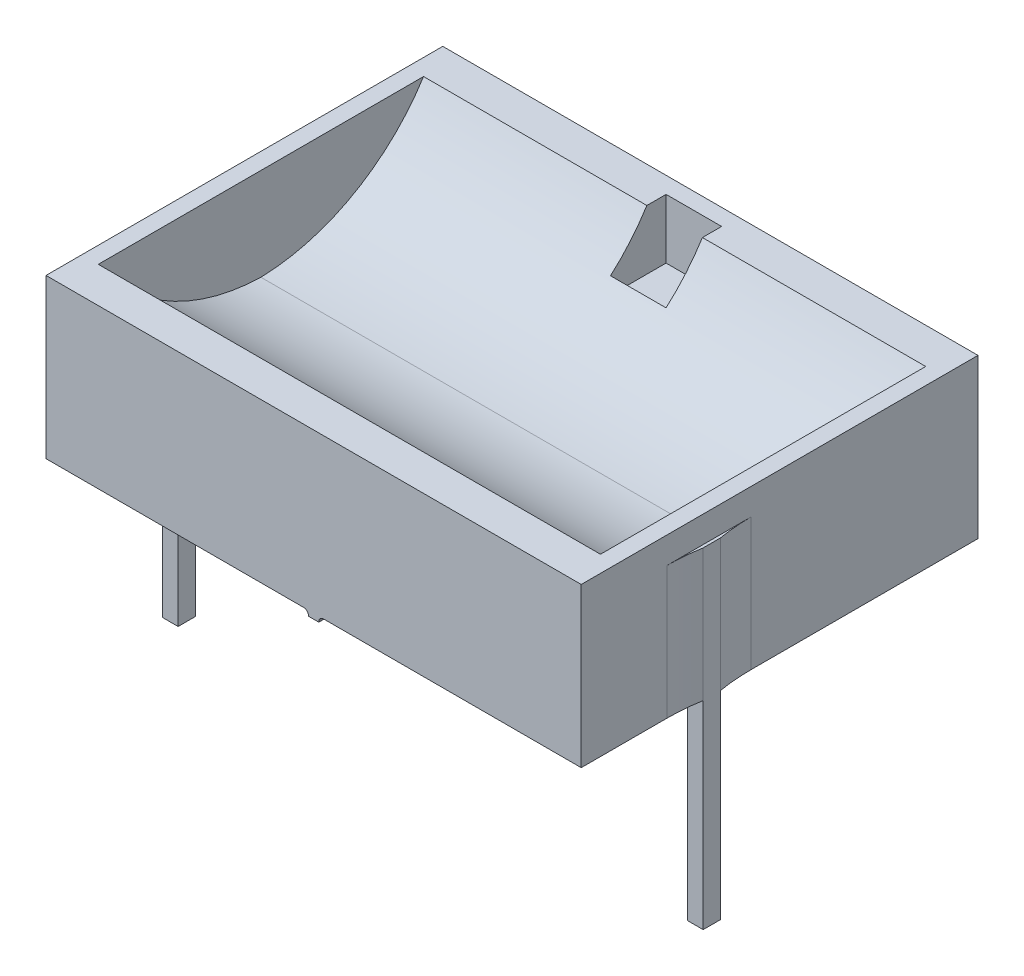
ISO-10303-21;
HEADER;
FILE_DESCRIPTION(('STEP AP214'),'2;1');
FILE_NAME('part.step','',(''),(''),'','','');
FILE_SCHEMA(('AUTOMOTIVE_DESIGN { 1 0 10303 214 1 1 1 1 }'));
ENDSEC;
DATA;
#1=APPLICATION_CONTEXT('core data for automotive mechanical design processes');
#2=APPLICATION_PROTOCOL_DEFINITION('international standard','automotive_design',2000,#1);
#3=PRODUCT_CONTEXT('',#1,'mechanical');
#4=PRODUCT('Part','Part','',(#3));
#5=PRODUCT_RELATED_PRODUCT_CATEGORY('part','',(#4));
#6=PRODUCT_DEFINITION_FORMATION('','',#4);
#7=PRODUCT_DEFINITION_CONTEXT('part definition',#1,'design');
#8=PRODUCT_DEFINITION('design','',#6,#7);
#9=PRODUCT_DEFINITION_SHAPE('','',#8);
#10=(LENGTH_UNIT() NAMED_UNIT(*) SI_UNIT(.MILLI.,.METRE.));
#11=(NAMED_UNIT(*) PLANE_ANGLE_UNIT() SI_UNIT($,.RADIAN.));
#12=(NAMED_UNIT(*) SI_UNIT($,.STERADIAN.) SOLID_ANGLE_UNIT());
#13=UNCERTAINTY_MEASURE_WITH_UNIT(LENGTH_MEASURE(1.E-05),#10,'distance_accuracy_value','');
#14=(GEOMETRIC_REPRESENTATION_CONTEXT(3) GLOBAL_UNCERTAINTY_ASSIGNED_CONTEXT((#13)) GLOBAL_UNIT_ASSIGNED_CONTEXT((#10,
#11,#12)) REPRESENTATION_CONTEXT('',''));
#15=CARTESIAN_POINT('',(0.,0.,0.));
#16=DIRECTION('',(0.,0.,1.));
#17=DIRECTION('',(1.,0.,0.));
#18=AXIS2_PLACEMENT_3D('',#15,#16,#17);
#19=CARTESIAN_POINT('',(0.,0.,0.));
#20=DIRECTION('',(0.,-1.,0.));
#21=DIRECTION('',(0.,0.,-1.));
#22=AXIS2_PLACEMENT_3D('',#19,#20,#21);
#23=PLANE('',#22);
#24=DIRECTION('',(-1.,0.,0.));
#25=VECTOR('',#24,1.);
#26=CARTESIAN_POINT('',(0.,0.,-76.2));
#27=LINE('',#26,#25);
#28=CARTESIAN_POINT('',(49.4969,0.,-76.2));
#29=VERTEX_POINT('',#28);
#30=CARTESIAN_POINT('',(0.,0.,-76.2));
#31=VERTEX_POINT('',#30);
#32=EDGE_CURVE('E403',#29,#31,#27,.T.);
#33=ORIENTED_EDGE('',*,*,#32,.F.);
#34=DIRECTION('',(0.,0.,-1.));
#35=VECTOR('',#34,1.);
#36=CARTESIAN_POINT('',(49.4969,0.,0.));
#37=LINE('',#36,#35);
#38=CARTESIAN_POINT('',(49.4969,0.,0.));
#39=VERTEX_POINT('',#38);
#40=EDGE_CURVE('E485',#29,#39,#37,.F.);
#41=ORIENTED_EDGE('',*,*,#40,.T.);
#42=DIRECTION('',(1.,0.,0.));
#43=VECTOR('',#42,1.);
#44=CARTESIAN_POINT('',(0.,0.,0.));
#45=LINE('',#44,#43);
#46=CARTESIAN_POINT('',(0.,0.,0.));
#47=VERTEX_POINT('',#46);
#48=EDGE_CURVE('E396',#47,#39,#45,.T.);
#49=ORIENTED_EDGE('',*,*,#48,.F.);
#50=DIRECTION('',(0.,0.,1.));
#51=VECTOR('',#50,1.);
#52=CARTESIAN_POINT('',(0.,0.,0.));
#53=LINE('',#52,#51);
#54=CARTESIAN_POINT('',(0.,0.,-16.4453569801987));
#55=VERTEX_POINT('',#54);
#56=EDGE_CURVE('E391',#55,#47,#53,.T.);
#57=ORIENTED_EDGE('',*,*,#56,.F.);
#58=CARTESIAN_POINT('',(-38.1,0.,-16.4453569801987));
#59=DIRECTION('',(0.,-1.,0.));
#60=DIRECTION('',(0.,0.,-1.));
#61=AXIS2_PLACEMENT_3D('',#58,#59,#60);
#62=CIRCLE('',#61,38.1);
#63=CARTESIAN_POINT('',(-0.546100000000003,0.,-22.873));
#64=VERTEX_POINT('',#63);
#65=EDGE_CURVE('E467',#55,#64,#62,.F.);
#66=ORIENTED_EDGE('',*,*,#65,.T.);
#67=DIRECTION('',(1.,0.,0.));
#68=VECTOR('',#67,1.);
#69=CARTESIAN_POINT('',(0.,0.,-22.873));
#70=LINE('',#69,#68);
#71=CARTESIAN_POINT('',(2.50189999999999,0.,-22.873));
#72=VERTEX_POINT('',#71);
#73=EDGE_CURVE('E423',#64,#72,#70,.T.);
#74=ORIENTED_EDGE('',*,*,#73,.T.);
#75=DIRECTION('',(0.,0.,-1.));
#76=VECTOR('',#75,1.);
#77=CARTESIAN_POINT('',(2.50189999999999,0.,0.));
#78=LINE('',#77,#76);
#79=CARTESIAN_POINT('',(2.50189999999999,0.,-26.175));
#80=VERTEX_POINT('',#79);
#81=EDGE_CURVE('E420',#72,#80,#78,.T.);
#82=ORIENTED_EDGE('',*,*,#81,.T.);
#83=DIRECTION('',(-1.,0.,0.));
#84=VECTOR('',#83,1.);
#85=CARTESIAN_POINT('',(0.,0.,-26.175));
#86=LINE('',#85,#84);
#87=CARTESIAN_POINT('',(-0.546100000000003,0.,-26.175));
#88=VERTEX_POINT('',#87);
#89=EDGE_CURVE('E418',#80,#88,#86,.T.);
#90=ORIENTED_EDGE('',*,*,#89,.T.);
#91=CARTESIAN_POINT('',(-38.1,0.,-32.6026430198013));
#92=DIRECTION('',(0.,-1.,0.));
#93=DIRECTION('',(0.,0.,-1.));
#94=AXIS2_PLACEMENT_3D('',#91,#92,#93);
#95=CIRCLE('',#94,38.1);
#96=CARTESIAN_POINT('',(0.,0.,-32.6026430198013));
#97=VERTEX_POINT('',#96);
#98=EDGE_CURVE('E470',#88,#97,#95,.F.);
#99=ORIENTED_EDGE('',*,*,#98,.T.);
#100=EDGE_CURVE('E392',#31,#97,#53,.T.);
#101=ORIENTED_EDGE('',*,*,#100,.F.);
#102=EDGE_LOOP('',(#33,#41,#49,#57,#66,#74,#82,#90,#99,#101));
#103=FACE_BOUND('',#102,.T.);
#104=ADVANCED_FACE('F45',(#103),#23,.T.);
#105=CARTESIAN_POINT('',(53.2969,0.,0.));
#106=VERTEX_POINT('',#105);
#107=CARTESIAN_POINT('',(102.7938,0.,0.));
#108=VERTEX_POINT('',#107);
#109=EDGE_CURVE('E395',#106,#108,#45,.T.);
#110=ORIENTED_EDGE('',*,*,#109,.F.);
#111=DIRECTION('',(0.,0.,1.));
#112=VECTOR('',#111,1.);
#113=CARTESIAN_POINT('',(53.2969,0.,0.));
#114=LINE('',#113,#112);
#115=CARTESIAN_POINT('',(53.2969,0.,-76.2));
#116=VERTEX_POINT('',#115);
#117=EDGE_CURVE('E60',#106,#116,#114,.F.);
#118=ORIENTED_EDGE('',*,*,#117,.T.);
#119=CARTESIAN_POINT('',(102.7938,0.,-76.2));
#120=VERTEX_POINT('',#119);
#121=EDGE_CURVE('E404',#120,#116,#27,.T.);
#122=ORIENTED_EDGE('',*,*,#121,.F.);
#123=DIRECTION('',(0.,0.,-1.));
#124=VECTOR('',#123,1.);
#125=CARTESIAN_POINT('',(102.7938,0.,0.));
#126=LINE('',#125,#124);
#127=CARTESIAN_POINT('',(102.7938,0.,-32.6026430198014));
#128=VERTEX_POINT('',#127);
#129=EDGE_CURVE('E399',#128,#120,#126,.T.);
#130=ORIENTED_EDGE('',*,*,#129,.F.);
#131=CARTESIAN_POINT('',(140.8938,0.,-32.6026430198014));
#132=DIRECTION('',(0.,-1.,0.));
#133=DIRECTION('',(0.,0.,-1.));
#134=AXIS2_PLACEMENT_3D('',#131,#132,#133);
#135=CIRCLE('',#134,38.1);
#136=CARTESIAN_POINT('',(103.3399,0.,-26.175));
#137=VERTEX_POINT('',#136);
#138=EDGE_CURVE('E477',#128,#137,#135,.F.);
#139=ORIENTED_EDGE('',*,*,#138,.T.);
#140=DIRECTION('',(-1.,0.,0.));
#141=VECTOR('',#140,1.);
#142=CARTESIAN_POINT('',(0.,0.,-26.175));
#143=LINE('',#142,#141);
#144=CARTESIAN_POINT('',(100.2919,0.,-26.175));
#145=VERTEX_POINT('',#144);
#146=EDGE_CURVE('E372',#137,#145,#143,.T.);
#147=ORIENTED_EDGE('',*,*,#146,.T.);
#148=DIRECTION('',(0.,0.,1.));
#149=VECTOR('',#148,1.);
#150=CARTESIAN_POINT('',(100.2919,0.,0.));
#151=LINE('',#150,#149);
#152=CARTESIAN_POINT('',(100.2919,0.,-22.873));
#153=VERTEX_POINT('',#152);
#154=EDGE_CURVE('E430',#145,#153,#151,.T.);
#155=ORIENTED_EDGE('',*,*,#154,.T.);
#156=DIRECTION('',(1.,0.,0.));
#157=VECTOR('',#156,1.);
#158=CARTESIAN_POINT('',(0.,0.,-22.873));
#159=LINE('',#158,#157);
#160=CARTESIAN_POINT('',(103.3399,0.,-22.873));
#161=VERTEX_POINT('',#160);
#162=EDGE_CURVE('E370',#153,#161,#159,.T.);
#163=ORIENTED_EDGE('',*,*,#162,.T.);
#164=CARTESIAN_POINT('',(140.8938,0.,-16.4453569801986));
#165=DIRECTION('',(0.,-1.,0.));
#166=DIRECTION('',(0.,0.,-1.));
#167=AXIS2_PLACEMENT_3D('',#164,#165,#166);
#168=CIRCLE('',#167,38.1);
#169=CARTESIAN_POINT('',(102.7938,0.,-16.4453569801985));
#170=VERTEX_POINT('',#169);
#171=EDGE_CURVE('E480',#161,#170,#168,.F.);
#172=ORIENTED_EDGE('',*,*,#171,.T.);
#173=EDGE_CURVE('E400',#108,#170,#126,.T.);
#174=ORIENTED_EDGE('',*,*,#173,.F.);
#175=EDGE_LOOP('',(#110,#118,#122,#130,#139,#147,#155,#163,#172,#174));
#176=FACE_BOUND('',#175,.T.);
#177=ADVANCED_FACE('F553',(#176),#23,.T.);
#178=CARTESIAN_POINT('',(102.7938,38.1,0.));
#179=DIRECTION('',(-1.,0.,0.));
#180=DIRECTION('',(0.,0.,1.));
#181=AXIS2_PLACEMENT_3D('',#178,#179,#180);
#182=PLANE('',#181);
#183=DIRECTION('',(0.,0.,1.));
#184=VECTOR('',#183,1.);
#185=CARTESIAN_POINT('',(102.7938,25.4,0.));
#186=LINE('',#185,#184);
#187=CARTESIAN_POINT('',(102.7938,25.4,-32.6026430198014));
#188=VERTEX_POINT('',#187);
#189=CARTESIAN_POINT('',(102.7938,25.4,-16.4453569801986));
#190=VERTEX_POINT('',#189);
#191=EDGE_CURVE('E428',#188,#190,#186,.T.);
#192=ORIENTED_EDGE('',*,*,#191,.F.);
#193=DIRECTION('',(0.,-1.,0.));
#194=VECTOR('',#193,1.);
#195=CARTESIAN_POINT('',(102.7938,38.1,-32.6026430198014));
#196=LINE('',#195,#194);
#197=EDGE_CURVE('E462',#188,#128,#196,.T.);
#198=ORIENTED_EDGE('',*,*,#197,.T.);
#199=ORIENTED_EDGE('',*,*,#129,.T.);
#200=DIRECTION('',(0.,-1.,0.));
#201=VECTOR('',#200,1.);
#202=CARTESIAN_POINT('',(102.7938,38.1,-76.2));
#203=LINE('',#202,#201);
#204=CARTESIAN_POINT('',(102.7938,30.48,-76.2));
#205=VERTEX_POINT('',#204);
#206=EDGE_CURVE('E409',#205,#120,#203,.T.);
#207=ORIENTED_EDGE('',*,*,#206,.F.);
#208=DIRECTION('',(0.,0.,-1.));
#209=VECTOR('',#208,1.);
#210=CARTESIAN_POINT('',(102.7938,30.48,-76.2));
#211=LINE('',#210,#209);
#212=CARTESIAN_POINT('',(102.7938,30.48,0.));
#213=VERTEX_POINT('',#212);
#214=EDGE_CURVE('E311',#213,#205,#211,.T.);
#215=ORIENTED_EDGE('',*,*,#214,.F.);
#216=DIRECTION('',(0.,-1.,0.));
#217=VECTOR('',#216,1.);
#218=CARTESIAN_POINT('',(102.7938,38.1,0.));
#219=LINE('',#218,#217);
#220=EDGE_CURVE('E412',#213,#108,#219,.T.);
#221=ORIENTED_EDGE('',*,*,#220,.T.);
#222=ORIENTED_EDGE('',*,*,#173,.T.);
#223=DIRECTION('',(0.,1.,0.));
#224=VECTOR('',#223,1.);
#225=CARTESIAN_POINT('',(102.7938,38.1,-16.4453569801986));
#226=LINE('',#225,#224);
#227=EDGE_CURVE('E459',#170,#190,#226,.T.);
#228=ORIENTED_EDGE('',*,*,#227,.T.);
#229=EDGE_LOOP('',(#192,#198,#199,#207,#215,#221,#222,#228));
#230=FACE_BOUND('',#229,.T.);
#231=ADVANCED_FACE('F559',(#230),#182,.F.);
#232=CARTESIAN_POINT('',(0.,38.1,0.));
#233=DIRECTION('',(1.,0.,0.));
#234=DIRECTION('',(0.,0.,-1.));
#235=AXIS2_PLACEMENT_3D('',#232,#233,#234);
#236=PLANE('',#235);
#237=DIRECTION('',(0.,0.,1.));
#238=VECTOR('',#237,1.);
#239=CARTESIAN_POINT('',(0.,25.4,0.));
#240=LINE('',#239,#238);
#241=CARTESIAN_POINT('',(0.,25.4,-32.6026430198013));
#242=VERTEX_POINT('',#241);
#243=CARTESIAN_POINT('',(0.,25.4,-16.4453569801987));
#244=VERTEX_POINT('',#243);
#245=EDGE_CURVE('E426',#242,#244,#240,.T.);
#246=ORIENTED_EDGE('',*,*,#245,.T.);
#247=DIRECTION('',(0.,-1.,0.));
#248=VECTOR('',#247,1.);
#249=CARTESIAN_POINT('',(0.,38.1,-16.4453569801987));
#250=LINE('',#249,#248);
#251=EDGE_CURVE('E457',#244,#55,#250,.T.);
#252=ORIENTED_EDGE('',*,*,#251,.T.);
#253=ORIENTED_EDGE('',*,*,#56,.T.);
#254=DIRECTION('',(0.,-1.,0.));
#255=VECTOR('',#254,1.);
#256=CARTESIAN_POINT('',(0.,38.1,0.));
#257=LINE('',#256,#255);
#258=CARTESIAN_POINT('',(0.,30.48,0.));
#259=VERTEX_POINT('',#258);
#260=EDGE_CURVE('E415',#259,#47,#257,.T.);
#261=ORIENTED_EDGE('',*,*,#260,.F.);
#262=DIRECTION('',(0.,0.,1.));
#263=VECTOR('',#262,1.);
#264=CARTESIAN_POINT('',(0.,30.48,-76.2));
#265=LINE('',#264,#263);
#266=CARTESIAN_POINT('',(0.,30.48,-76.2));
#267=VERTEX_POINT('',#266);
#268=EDGE_CURVE('E299',#267,#259,#265,.T.);
#269=ORIENTED_EDGE('',*,*,#268,.F.);
#270=DIRECTION('',(0.,-1.,0.));
#271=VECTOR('',#270,1.);
#272=CARTESIAN_POINT('',(0.,38.1,-76.2));
#273=LINE('',#272,#271);
#274=EDGE_CURVE('E406',#267,#31,#273,.T.);
#275=ORIENTED_EDGE('',*,*,#274,.T.);
#276=ORIENTED_EDGE('',*,*,#100,.T.);
#277=DIRECTION('',(0.,1.,0.));
#278=VECTOR('',#277,1.);
#279=CARTESIAN_POINT('',(0.,38.1,-32.6026430198013));
#280=LINE('',#279,#278);
#281=EDGE_CURVE('E454',#97,#242,#280,.T.);
#282=ORIENTED_EDGE('',*,*,#281,.T.);
#283=EDGE_LOOP('',(#246,#252,#253,#261,#269,#275,#276,#282));
#284=FACE_BOUND('',#283,.T.);
#285=ADVANCED_FACE('F510',(#284),#236,.F.);
#286=CARTESIAN_POINT('',(0.,38.1,0.));
#287=DIRECTION('',(0.,0.,-1.));
#288=DIRECTION('',(-1.,0.,0.));
#289=AXIS2_PLACEMENT_3D('',#286,#287,#288);
#290=PLANE('',#289);
#291=DIRECTION('',(1.,0.,0.));
#292=VECTOR('',#291,1.);
#293=CARTESIAN_POINT('',(0.,30.48,0.));
#294=LINE('',#293,#292);
#295=EDGE_CURVE('E309',#259,#213,#294,.T.);
#296=ORIENTED_EDGE('',*,*,#295,.F.);
#297=ORIENTED_EDGE('',*,*,#260,.T.);
#298=ORIENTED_EDGE('',*,*,#48,.T.);
#299=CARTESIAN_POINT('',(49.4969,-0.9,0.));
#300=DIRECTION('',(0.,0.,-1.));
#301=DIRECTION('',(-1.,0.,0.));
#302=AXIS2_PLACEMENT_3D('',#299,#300,#301);
#303=CIRCLE('',#302,0.9);
#304=CARTESIAN_POINT('',(50.3969,-0.9,0.));
#305=VERTEX_POINT('',#304);
#306=EDGE_CURVE('E493',#39,#305,#303,.T.);
#307=ORIENTED_EDGE('',*,*,#306,.T.);
#308=DIRECTION('',(0.,1.,0.));
#309=VECTOR('',#308,1.);
#310=CARTESIAN_POINT('',(50.3969,-1.,0.));
#311=LINE('',#310,#309);
#312=CARTESIAN_POINT('',(50.3969,-1.,0.));
#313=VERTEX_POINT('',#312);
#314=EDGE_CURVE('E497',#313,#305,#311,.T.);
#315=ORIENTED_EDGE('',*,*,#314,.F.);
#316=DIRECTION('',(-1.,0.,0.));
#317=VECTOR('',#316,1.);
#318=CARTESIAN_POINT('',(50.3969,-1.,0.));
#319=LINE('',#318,#317);
#320=CARTESIAN_POINT('',(52.3969,-1.,0.));
#321=VERTEX_POINT('',#320);
#322=EDGE_CURVE('E269',#321,#313,#319,.T.);
#323=ORIENTED_EDGE('',*,*,#322,.F.);
#324=DIRECTION('',(0.,1.,0.));
#325=VECTOR('',#324,1.);
#326=CARTESIAN_POINT('',(52.3969,-1.,0.));
#327=LINE('',#326,#325);
#328=CARTESIAN_POINT('',(52.3969,-0.9,0.));
#329=VERTEX_POINT('',#328);
#330=EDGE_CURVE('E283',#321,#329,#327,.T.);
#331=ORIENTED_EDGE('',*,*,#330,.T.);
#332=CARTESIAN_POINT('',(53.2969,-0.9,0.));
#333=DIRECTION('',(0.,0.,-1.));
#334=DIRECTION('',(-1.,0.,0.));
#335=AXIS2_PLACEMENT_3D('',#332,#333,#334);
#336=CIRCLE('',#335,0.9);
#337=EDGE_CURVE('E53',#329,#106,#336,.T.);
#338=ORIENTED_EDGE('',*,*,#337,.T.);
#339=ORIENTED_EDGE('',*,*,#109,.T.);
#340=ORIENTED_EDGE('',*,*,#220,.F.);
#341=EDGE_LOOP('',(#296,#297,#298,#307,#315,#323,#331,#338,#339,#340));
#342=FACE_BOUND('',#341,.T.);
#343=ADVANCED_FACE('F496',(#342),#290,.F.);
#344=CARTESIAN_POINT('',(0.,38.1,-76.2));
#345=DIRECTION('',(0.,0.,1.));
#346=DIRECTION('',(1.,0.,0.));
#347=AXIS2_PLACEMENT_3D('',#344,#345,#346);
#348=PLANE('',#347);
#349=DIRECTION('',(-1.,0.,0.));
#350=VECTOR('',#349,1.);
#351=CARTESIAN_POINT('',(0.,30.48,-76.2));
#352=LINE('',#351,#350);
#353=EDGE_CURVE('E313',#205,#267,#352,.T.);
#354=ORIENTED_EDGE('',*,*,#353,.F.);
#355=ORIENTED_EDGE('',*,*,#206,.T.);
#356=ORIENTED_EDGE('',*,*,#121,.T.);
#357=CARTESIAN_POINT('',(53.2969,-0.9,-76.2));
#358=DIRECTION('',(0.,0.,1.));
#359=DIRECTION('',(1.,0.,0.));
#360=AXIS2_PLACEMENT_3D('',#357,#358,#359);
#361=CIRCLE('',#360,0.9);
#362=CARTESIAN_POINT('',(52.3969,-0.9,-76.2));
#363=VERTEX_POINT('',#362);
#364=EDGE_CURVE('E11',#116,#363,#361,.T.);
#365=ORIENTED_EDGE('',*,*,#364,.T.);
#366=DIRECTION('',(0.,1.,0.));
#367=VECTOR('',#366,1.);
#368=CARTESIAN_POINT('',(52.3969,-1.,-76.2));
#369=LINE('',#368,#367);
#370=CARTESIAN_POINT('',(52.3969,-1.,-76.2));
#371=VERTEX_POINT('',#370);
#372=EDGE_CURVE('E260',#371,#363,#369,.T.);
#373=ORIENTED_EDGE('',*,*,#372,.F.);
#374=DIRECTION('',(1.,0.,0.));
#375=VECTOR('',#374,1.);
#376=CARTESIAN_POINT('',(50.3969,-1.,-76.2));
#377=LINE('',#376,#375);
#378=CARTESIAN_POINT('',(50.3969,-1.,-76.2));
#379=VERTEX_POINT('',#378);
#380=EDGE_CURVE('E253',#379,#371,#377,.T.);
#381=ORIENTED_EDGE('',*,*,#380,.F.);
#382=DIRECTION('',(0.,1.,0.));
#383=VECTOR('',#382,1.);
#384=CARTESIAN_POINT('',(50.3969,-1.,-76.2));
#385=LINE('',#384,#383);
#386=CARTESIAN_POINT('',(50.3969,-0.9,-76.2));
#387=VERTEX_POINT('',#386);
#388=EDGE_CURVE('E258',#379,#387,#385,.T.);
#389=ORIENTED_EDGE('',*,*,#388,.T.);
#390=CARTESIAN_POINT('',(49.4969,-0.9,-76.2));
#391=DIRECTION('',(0.,0.,1.));
#392=DIRECTION('',(1.,0.,0.));
#393=AXIS2_PLACEMENT_3D('',#390,#391,#392);
#394=CIRCLE('',#393,0.9);
#395=EDGE_CURVE('E491',#387,#29,#394,.T.);
#396=ORIENTED_EDGE('',*,*,#395,.T.);
#397=ORIENTED_EDGE('',*,*,#32,.T.);
#398=ORIENTED_EDGE('',*,*,#274,.F.);
#399=EDGE_LOOP('',(#354,#355,#356,#365,#373,#381,#389,#396,#397,#398));
#400=FACE_BOUND('',#399,.T.);
#401=ADVANCED_FACE('F256',(#400),#348,.F.);
#402=CARTESIAN_POINT('',(0.,25.4,0.));
#403=DIRECTION('',(0.,1.,0.));
#404=DIRECTION('',(0.,0.,1.));
#405=AXIS2_PLACEMENT_3D('',#402,#403,#404);
#406=PLANE('',#405);
#407=ORIENTED_EDGE('',*,*,#245,.F.);
#408=CARTESIAN_POINT('',(-38.1,25.4,-32.6026430198013));
#409=DIRECTION('',(0.,1.,0.));
#410=DIRECTION('',(0.,0.,1.));
#411=AXIS2_PLACEMENT_3D('',#408,#409,#410);
#412=CIRCLE('',#411,38.1);
#413=CARTESIAN_POINT('',(-0.546100000000003,25.4,-26.175));
#414=VERTEX_POINT('',#413);
#415=EDGE_CURVE('E472',#242,#414,#412,.F.);
#416=ORIENTED_EDGE('',*,*,#415,.T.);
#417=DIRECTION('',(0.,0.,-1.));
#418=VECTOR('',#417,1.);
#419=CARTESIAN_POINT('',(-0.546100000000003,25.4,-22.873));
#420=LINE('',#419,#418);
#421=CARTESIAN_POINT('',(-0.546100000000003,25.4,-22.873));
#422=VERTEX_POINT('',#421);
#423=EDGE_CURVE('E374',#422,#414,#420,.T.);
#424=ORIENTED_EDGE('',*,*,#423,.F.);
#425=CARTESIAN_POINT('',(-38.1,25.4,-16.4453569801987));
#426=DIRECTION('',(0.,1.,0.));
#427=DIRECTION('',(0.,0.,1.));
#428=AXIS2_PLACEMENT_3D('',#425,#426,#427);
#429=CIRCLE('',#428,38.1);
#430=EDGE_CURVE('E464',#422,#244,#429,.F.);
#431=ORIENTED_EDGE('',*,*,#430,.T.);
#432=EDGE_LOOP('',(#407,#416,#424,#431));
#433=FACE_BOUND('',#432,.T.);
#434=ADVANCED_FACE('F519',(#433),#406,.T.);
#435=CARTESIAN_POINT('',(2.50189999999999,-25.4,-22.873));
#436=DIRECTION('',(0.,0.,-1.));
#437=DIRECTION('',(-1.,0.,0.));
#438=AXIS2_PLACEMENT_3D('',#435,#436,#437);
#439=PLANE('',#438);
#440=ORIENTED_EDGE('',*,*,#73,.F.);
#441=DIRECTION('',(0.,1.,0.));
#442=VECTOR('',#441,1.);
#443=CARTESIAN_POINT('',(-0.546100000000003,-25.4,-22.873));
#444=LINE('',#443,#442);
#445=CARTESIAN_POINT('',(-0.546100000000003,-38.1,-22.873));
#446=VERTEX_POINT('',#445);
#447=EDGE_CURVE('E385',#446,#64,#444,.T.);
#448=ORIENTED_EDGE('',*,*,#447,.F.);
#449=DIRECTION('',(-1.,0.,0.));
#450=VECTOR('',#449,1.);
#451=CARTESIAN_POINT('',(-0.546100000000003,-38.1,-22.873));
#452=LINE('',#451,#450);
#453=CARTESIAN_POINT('',(2.50189999999999,-38.1,-22.873));
#454=VERTEX_POINT('',#453);
#455=EDGE_CURVE('E297',#454,#446,#452,.T.);
#456=ORIENTED_EDGE('',*,*,#455,.F.);
#457=DIRECTION('',(0.,1.,0.));
#458=VECTOR('',#457,1.);
#459=CARTESIAN_POINT('',(2.50189999999999,-25.4,-22.873));
#460=LINE('',#459,#458);
#461=EDGE_CURVE('E388',#454,#72,#460,.T.);
#462=ORIENTED_EDGE('',*,*,#461,.T.);
#463=EDGE_LOOP('',(#440,#448,#456,#462));
#464=FACE_BOUND('',#463,.T.);
#465=ADVANCED_FACE('F532',(#464),#439,.F.);
#466=CARTESIAN_POINT('',(2.50189999999999,-25.4,-26.175));
#467=DIRECTION('',(0.,0.,1.));
#468=DIRECTION('',(1.,0.,0.));
#469=AXIS2_PLACEMENT_3D('',#466,#467,#468);
#470=PLANE('',#469);
#471=DIRECTION('',(0.,1.,0.));
#472=VECTOR('',#471,1.);
#473=CARTESIAN_POINT('',(-0.546100000000003,-25.4,-26.175));
#474=LINE('',#473,#472);
#475=CARTESIAN_POINT('',(-0.546100000000003,-38.1,-26.175));
#476=VERTEX_POINT('',#475);
#477=EDGE_CURVE('E381',#476,#88,#474,.T.);
#478=ORIENTED_EDGE('',*,*,#477,.T.);
#479=ORIENTED_EDGE('',*,*,#89,.F.);
#480=DIRECTION('',(0.,1.,0.));
#481=VECTOR('',#480,1.);
#482=CARTESIAN_POINT('',(2.50189999999999,-25.4,-26.175));
#483=LINE('',#482,#481);
#484=CARTESIAN_POINT('',(2.50189999999999,-38.1,-26.175));
#485=VERTEX_POINT('',#484);
#486=EDGE_CURVE('E377',#485,#80,#483,.T.);
#487=ORIENTED_EDGE('',*,*,#486,.F.);
#488=DIRECTION('',(1.,0.,0.));
#489=VECTOR('',#488,1.);
#490=CARTESIAN_POINT('',(-0.546100000000003,-38.1,-26.175));
#491=LINE('',#490,#489);
#492=EDGE_CURVE('E290',#476,#485,#491,.T.);
#493=ORIENTED_EDGE('',*,*,#492,.F.);
#494=EDGE_LOOP('',(#478,#479,#487,#493));
#495=FACE_BOUND('',#494,.T.);
#496=ADVANCED_FACE('F541',(#495),#470,.F.);
#497=CARTESIAN_POINT('',(2.50189999999999,-25.4,-22.873));
#498=DIRECTION('',(-1.,0.,0.));
#499=DIRECTION('',(0.,0.,1.));
#500=AXIS2_PLACEMENT_3D('',#497,#498,#499);
#501=PLANE('',#500);
#502=ORIENTED_EDGE('',*,*,#81,.F.);
#503=ORIENTED_EDGE('',*,*,#461,.F.);
#504=DIRECTION('',(0.,0.,1.));
#505=VECTOR('',#504,1.);
#506=CARTESIAN_POINT('',(2.50189999999999,-38.1,-22.873));
#507=LINE('',#506,#505);
#508=EDGE_CURVE('E294',#485,#454,#507,.T.);
#509=ORIENTED_EDGE('',*,*,#508,.F.);
#510=ORIENTED_EDGE('',*,*,#486,.T.);
#511=EDGE_LOOP('',(#502,#503,#509,#510));
#512=FACE_BOUND('',#511,.T.);
#513=ADVANCED_FACE('F536',(#512),#501,.F.);
#514=CARTESIAN_POINT('',(-0.546100000000003,-25.4,-22.873));
#515=DIRECTION('',(1.,0.,0.));
#516=DIRECTION('',(0.,0.,-1.));
#517=AXIS2_PLACEMENT_3D('',#514,#515,#516);
#518=PLANE('',#517);
#519=ORIENTED_EDGE('',*,*,#423,.T.);
#520=EDGE_CURVE('E380',#88,#414,#474,.T.);
#521=ORIENTED_EDGE('',*,*,#520,.F.);
#522=ORIENTED_EDGE('',*,*,#477,.F.);
#523=DIRECTION('',(0.,0.,-1.));
#524=VECTOR('',#523,1.);
#525=CARTESIAN_POINT('',(-0.546100000000003,-38.1,-22.873));
#526=LINE('',#525,#524);
#527=EDGE_CURVE('E287',#446,#476,#526,.T.);
#528=ORIENTED_EDGE('',*,*,#527,.F.);
#529=ORIENTED_EDGE('',*,*,#447,.T.);
#530=EDGE_CURVE('E384',#64,#422,#444,.T.);
#531=ORIENTED_EDGE('',*,*,#530,.T.);
#532=EDGE_LOOP('',(#519,#521,#522,#528,#529,#531));
#533=FACE_BOUND('',#532,.T.);
#534=ADVANCED_FACE('F522',(#533),#518,.F.);
#535=CARTESIAN_POINT('',(0.,25.4,0.));
#536=DIRECTION('',(0.,-1.,0.));
#537=DIRECTION('',(0.,0.,-1.));
#538=AXIS2_PLACEMENT_3D('',#535,#536,#537);
#539=PLANE('',#538);
#540=DIRECTION('',(0.,0.,1.));
#541=VECTOR('',#540,1.);
#542=CARTESIAN_POINT('',(103.3399,25.4,-22.873));
#543=LINE('',#542,#541);
#544=CARTESIAN_POINT('',(103.3399,25.4,-26.175));
#545=VERTEX_POINT('',#544);
#546=CARTESIAN_POINT('',(103.3399,25.4,-22.873));
#547=VERTEX_POINT('',#546);
#548=EDGE_CURVE('E367',#545,#547,#543,.T.);
#549=ORIENTED_EDGE('',*,*,#548,.F.);
#550=CARTESIAN_POINT('',(140.8938,25.4,-32.6026430198014));
#551=DIRECTION('',(0.,-1.,0.));
#552=DIRECTION('',(0.,0.,-1.));
#553=AXIS2_PLACEMENT_3D('',#550,#551,#552);
#554=CIRCLE('',#553,38.1);
#555=EDGE_CURVE('E474',#545,#188,#554,.T.);
#556=ORIENTED_EDGE('',*,*,#555,.T.);
#557=ORIENTED_EDGE('',*,*,#191,.T.);
#558=CARTESIAN_POINT('',(140.8938,25.4,-16.4453569801986));
#559=DIRECTION('',(0.,-1.,0.));
#560=DIRECTION('',(0.,0.,-1.));
#561=AXIS2_PLACEMENT_3D('',#558,#559,#560);
#562=CIRCLE('',#561,38.1);
#563=EDGE_CURVE('E482',#190,#547,#562,.T.);
#564=ORIENTED_EDGE('',*,*,#563,.T.);
#565=EDGE_LOOP('',(#549,#556,#557,#564));
#566=FACE_BOUND('',#565,.T.);
#567=ADVANCED_FACE('F643',(#566),#539,.F.);
#568=CARTESIAN_POINT('',(100.2919,-25.4,-22.873));
#569=DIRECTION('',(1.,0.,0.));
#570=DIRECTION('',(0.,0.,-1.));
#571=AXIS2_PLACEMENT_3D('',#568,#569,#570);
#572=PLANE('',#571);
#573=ORIENTED_EDGE('',*,*,#154,.F.);
#574=DIRECTION('',(0.,1.,0.));
#575=VECTOR('',#574,1.);
#576=CARTESIAN_POINT('',(100.2919,-25.4,-26.175));
#577=LINE('',#576,#575);
#578=CARTESIAN_POINT('',(100.2919,-38.1,-26.175));
#579=VERTEX_POINT('',#578);
#580=EDGE_CURVE('E353',#579,#145,#577,.T.);
#581=ORIENTED_EDGE('',*,*,#580,.F.);
#582=DIRECTION('',(0.,0.,-1.));
#583=VECTOR('',#582,1.);
#584=CARTESIAN_POINT('',(100.2919,-38.1,-22.873));
#585=LINE('',#584,#583);
#586=CARTESIAN_POINT('',(100.2919,-38.1,-22.873));
#587=VERTEX_POINT('',#586);
#588=EDGE_CURVE('E281',#587,#579,#585,.T.);
#589=ORIENTED_EDGE('',*,*,#588,.F.);
#590=DIRECTION('',(0.,1.,0.));
#591=VECTOR('',#590,1.);
#592=CARTESIAN_POINT('',(100.2919,-25.4,-22.873));
#593=LINE('',#592,#591);
#594=EDGE_CURVE('E364',#587,#153,#593,.T.);
#595=ORIENTED_EDGE('',*,*,#594,.T.);
#596=EDGE_LOOP('',(#573,#581,#589,#595));
#597=FACE_BOUND('',#596,.T.);
#598=ADVANCED_FACE('F639',(#597),#572,.F.);
#599=CARTESIAN_POINT('',(100.2919,-25.4,-26.175));
#600=DIRECTION('',(0.,0.,1.));
#601=DIRECTION('',(1.,0.,0.));
#602=AXIS2_PLACEMENT_3D('',#599,#600,#601);
#603=PLANE('',#602);
#604=ORIENTED_EDGE('',*,*,#146,.F.);
#605=DIRECTION('',(0.,1.,0.));
#606=VECTOR('',#605,1.);
#607=CARTESIAN_POINT('',(103.3399,-25.4,-26.175));
#608=LINE('',#607,#606);
#609=CARTESIAN_POINT('',(103.3399,-38.1,-26.175));
#610=VERTEX_POINT('',#609);
#611=EDGE_CURVE('E357',#610,#137,#608,.T.);
#612=ORIENTED_EDGE('',*,*,#611,.F.);
#613=DIRECTION('',(1.,0.,0.));
#614=VECTOR('',#613,1.);
#615=CARTESIAN_POINT('',(103.3399,-38.1,-26.175));
#616=LINE('',#615,#614);
#617=EDGE_CURVE('E278',#579,#610,#616,.T.);
#618=ORIENTED_EDGE('',*,*,#617,.F.);
#619=ORIENTED_EDGE('',*,*,#580,.T.);
#620=EDGE_LOOP('',(#604,#612,#618,#619));
#621=FACE_BOUND('',#620,.T.);
#622=ADVANCED_FACE('F642',(#621),#603,.F.);
#623=CARTESIAN_POINT('',(103.3399,-25.4,-22.873));
#624=DIRECTION('',(-1.,0.,0.));
#625=DIRECTION('',(0.,0.,1.));
#626=AXIS2_PLACEMENT_3D('',#623,#624,#625);
#627=PLANE('',#626);
#628=ORIENTED_EDGE('',*,*,#548,.T.);
#629=DIRECTION('',(0.,1.,0.));
#630=VECTOR('',#629,1.);
#631=CARTESIAN_POINT('',(103.3399,-25.4,-22.873));
#632=LINE('',#631,#630);
#633=EDGE_CURVE('E360',#161,#547,#632,.T.);
#634=ORIENTED_EDGE('',*,*,#633,.F.);
#635=CARTESIAN_POINT('',(103.3399,-38.1,-22.873));
#636=VERTEX_POINT('',#635);
#637=EDGE_CURVE('E361',#636,#161,#632,.T.);
#638=ORIENTED_EDGE('',*,*,#637,.F.);
#639=DIRECTION('',(0.,0.,1.));
#640=VECTOR('',#639,1.);
#641=CARTESIAN_POINT('',(103.3399,-38.1,-22.873));
#642=LINE('',#641,#640);
#643=EDGE_CURVE('E291',#610,#636,#642,.T.);
#644=ORIENTED_EDGE('',*,*,#643,.F.);
#645=ORIENTED_EDGE('',*,*,#611,.T.);
#646=EDGE_CURVE('E356',#137,#545,#608,.T.);
#647=ORIENTED_EDGE('',*,*,#646,.T.);
#648=EDGE_LOOP('',(#628,#634,#638,#644,#645,#647));
#649=FACE_BOUND('',#648,.T.);
#650=ADVANCED_FACE('F647',(#649),#627,.F.);
#651=CARTESIAN_POINT('',(100.2919,-25.4,-22.873));
#652=DIRECTION('',(0.,0.,-1.));
#653=DIRECTION('',(-1.,0.,0.));
#654=AXIS2_PLACEMENT_3D('',#651,#652,#653);
#655=PLANE('',#654);
#656=ORIENTED_EDGE('',*,*,#637,.T.);
#657=ORIENTED_EDGE('',*,*,#162,.F.);
#658=ORIENTED_EDGE('',*,*,#594,.F.);
#659=DIRECTION('',(-1.,0.,0.));
#660=VECTOR('',#659,1.);
#661=CARTESIAN_POINT('',(103.3399,-38.1,-22.873));
#662=LINE('',#661,#660);
#663=EDGE_CURVE('E303',#636,#587,#662,.T.);
#664=ORIENTED_EDGE('',*,*,#663,.F.);
#665=EDGE_LOOP('',(#656,#657,#658,#664));
#666=FACE_BOUND('',#665,.T.);
#667=ADVANCED_FACE('F619',(#666),#655,.F.);
#668=CARTESIAN_POINT('',(0.,30.48,0.));
#669=DIRECTION('',(0.,1.,0.));
#670=DIRECTION('',(0.,0.,1.));
#671=AXIS2_PLACEMENT_3D('',#668,#669,#670);
#672=PLANE('',#671);
#673=ORIENTED_EDGE('',*,*,#268,.T.);
#674=ORIENTED_EDGE('',*,*,#295,.T.);
#675=ORIENTED_EDGE('',*,*,#214,.T.);
#676=ORIENTED_EDGE('',*,*,#353,.T.);
#677=EDGE_LOOP('',(#673,#674,#675,#676));
#678=FACE_BOUND('',#677,.T.);
#679=DIRECTION('',(1.,0.,0.));
#680=VECTOR('',#679,1.);
#681=CARTESIAN_POINT('',(3.175,30.48,-6.86703753153483));
#682=LINE('',#681,#680);
#683=CARTESIAN_POINT('',(99.6188,30.48,-6.86703753153487));
#684=VERTEX_POINT('',#683);
#685=CARTESIAN_POINT('',(3.175,30.48,-6.86703753153483));
#686=VERTEX_POINT('',#685);
#687=EDGE_CURVE('E326',#684,#686,#682,.F.);
#688=ORIENTED_EDGE('',*,*,#687,.T.);
#689=DIRECTION('',(0.,0.,-1.));
#690=VECTOR('',#689,1.);
#691=CARTESIAN_POINT('',(3.175,30.48,-3.175));
#692=LINE('',#691,#690);
#693=CARTESIAN_POINT('',(3.175,30.48,-69.3329624684652));
#694=VERTEX_POINT('',#693);
#695=EDGE_CURVE('E324',#686,#694,#692,.T.);
#696=ORIENTED_EDGE('',*,*,#695,.T.);
#697=DIRECTION('',(-1.,0.,0.));
#698=VECTOR('',#697,1.);
#699=CARTESIAN_POINT('',(3.175,30.48,-69.3329624684652));
#700=LINE('',#699,#698);
#701=CARTESIAN_POINT('',(46.0629,30.48,-69.3329624684652));
#702=VERTEX_POINT('',#701);
#703=EDGE_CURVE('E321',#694,#702,#700,.F.);
#704=ORIENTED_EDGE('',*,*,#703,.T.);
#705=DIRECTION('',(0.,0.,-1.));
#706=VECTOR('',#705,1.);
#707=CARTESIAN_POINT('',(46.0629,30.48,-73.025));
#708=LINE('',#707,#706);
#709=CARTESIAN_POINT('',(46.0629,30.48,-73.025));
#710=VERTEX_POINT('',#709);
#711=EDGE_CURVE('E315',#702,#710,#708,.T.);
#712=ORIENTED_EDGE('',*,*,#711,.T.);
#713=DIRECTION('',(1.,0.,0.));
#714=VECTOR('',#713,1.);
#715=CARTESIAN_POINT('',(56.7309,30.48,-73.025));
#716=LINE('',#715,#714);
#717=CARTESIAN_POINT('',(56.7309,30.48,-73.025));
#718=VERTEX_POINT('',#717);
#719=EDGE_CURVE('E452',#710,#718,#716,.T.);
#720=ORIENTED_EDGE('',*,*,#719,.T.);
#721=DIRECTION('',(0.,0.,1.));
#722=VECTOR('',#721,1.);
#723=CARTESIAN_POINT('',(56.7309,30.48,-73.025));
#724=LINE('',#723,#722);
#725=CARTESIAN_POINT('',(56.7309,30.48,-69.3329624684652));
#726=VERTEX_POINT('',#725);
#727=EDGE_CURVE('E317',#718,#726,#724,.T.);
#728=ORIENTED_EDGE('',*,*,#727,.T.);
#729=CARTESIAN_POINT('',(99.6188,30.48,-69.3329624684652));
#730=VERTEX_POINT('',#729);
#731=EDGE_CURVE('E319',#726,#730,#700,.F.);
#732=ORIENTED_EDGE('',*,*,#731,.T.);
#733=DIRECTION('',(0.,0.,1.));
#734=VECTOR('',#733,1.);
#735=CARTESIAN_POINT('',(99.6188,30.48,-3.17500000000004));
#736=LINE('',#735,#734);
#737=EDGE_CURVE('E322',#730,#684,#736,.T.);
#738=ORIENTED_EDGE('',*,*,#737,.T.);
#739=EDGE_LOOP('',(#688,#696,#704,#712,#720,#728,#732,#738));
#740=FACE_BOUND('',#739,.T.);
#741=ADVANCED_FACE('F615',(#678,#740),#672,.T.);
#742=CARTESIAN_POINT('',(56.7309,19.05,-62.357));
#743=DIRECTION('',(0.,0.,1.));
#744=DIRECTION('',(1.,0.,0.));
#745=AXIS2_PLACEMENT_3D('',#742,#743,#744);
#746=PLANE('',#745);
#747=DIRECTION('',(0.,1.,0.));
#748=VECTOR('',#747,1.);
#749=CARTESIAN_POINT('',(56.7309,19.05,-62.357));
#750=LINE('',#749,#748);
#751=CARTESIAN_POINT('',(56.7309,19.05,-62.357));
#752=VERTEX_POINT('',#751);
#753=CARTESIAN_POINT('',(56.7309,22.2711592524946,-62.357));
#754=VERTEX_POINT('',#753);
#755=EDGE_CURVE('E341',#752,#754,#750,.T.);
#756=ORIENTED_EDGE('',*,*,#755,.F.);
#757=DIRECTION('',(1.,0.,0.));
#758=VECTOR('',#757,1.);
#759=CARTESIAN_POINT('',(56.7309,19.05,-62.357));
#760=LINE('',#759,#758);
#761=CARTESIAN_POINT('',(46.0629,19.05,-62.357));
#762=VERTEX_POINT('',#761);
#763=EDGE_CURVE('E337',#762,#752,#760,.T.);
#764=ORIENTED_EDGE('',*,*,#763,.F.);
#765=DIRECTION('',(0.,1.,0.));
#766=VECTOR('',#765,1.);
#767=CARTESIAN_POINT('',(46.0629,19.05,-62.357));
#768=LINE('',#767,#766);
#769=CARTESIAN_POINT('',(46.0629,22.2711592524946,-62.357));
#770=VERTEX_POINT('',#769);
#771=EDGE_CURVE('E345',#762,#770,#768,.T.);
#772=ORIENTED_EDGE('',*,*,#771,.T.);
#773=DIRECTION('',(-1.,0.,0.));
#774=VECTOR('',#773,1.);
#775=CARTESIAN_POINT('',(3.17499999999997,22.2711592524946,-62.357));
#776=LINE('',#775,#774);
#777=EDGE_CURVE('E447',#754,#770,#776,.T.);
#778=ORIENTED_EDGE('',*,*,#777,.F.);
#779=EDGE_LOOP('',(#756,#764,#772,#778));
#780=FACE_BOUND('',#779,.T.);
#781=ADVANCED_FACE('F618',(#780),#746,.F.);
#782=CARTESIAN_POINT('',(0.,19.05,0.));
#783=DIRECTION('',(0.,-1.,0.));
#784=DIRECTION('',(0.,0.,-1.));
#785=AXIS2_PLACEMENT_3D('',#782,#783,#784);
#786=PLANE('',#785);
#787=DIRECTION('',(0.,0.,-1.));
#788=VECTOR('',#787,1.);
#789=CARTESIAN_POINT('',(56.7309,19.05,-73.025));
#790=LINE('',#789,#788);
#791=CARTESIAN_POINT('',(56.7309,19.05,-73.025));
#792=VERTEX_POINT('',#791);
#793=EDGE_CURVE('E328',#752,#792,#790,.T.);
#794=ORIENTED_EDGE('',*,*,#793,.T.);
#795=DIRECTION('',(-1.,0.,0.));
#796=VECTOR('',#795,1.);
#797=CARTESIAN_POINT('',(56.7309,19.05,-73.025));
#798=LINE('',#797,#796);
#799=CARTESIAN_POINT('',(46.0629,19.05,-73.025));
#800=VERTEX_POINT('',#799);
#801=EDGE_CURVE('E331',#792,#800,#798,.T.);
#802=ORIENTED_EDGE('',*,*,#801,.T.);
#803=DIRECTION('',(0.,0.,1.));
#804=VECTOR('',#803,1.);
#805=CARTESIAN_POINT('',(46.0629,19.05,-73.025));
#806=LINE('',#805,#804);
#807=EDGE_CURVE('E334',#800,#762,#806,.T.);
#808=ORIENTED_EDGE('',*,*,#807,.T.);
#809=ORIENTED_EDGE('',*,*,#763,.T.);
#810=EDGE_LOOP('',(#794,#802,#808,#809));
#811=FACE_BOUND('',#810,.T.);
#812=ADVANCED_FACE('F621',(#811),#786,.F.);
#813=CARTESIAN_POINT('',(56.7309,19.05,-73.025));
#814=DIRECTION('',(0.,0.,-1.));
#815=DIRECTION('',(-1.,0.,0.));
#816=AXIS2_PLACEMENT_3D('',#813,#814,#815);
#817=PLANE('',#816);
#818=ORIENTED_EDGE('',*,*,#719,.F.);
#819=DIRECTION('',(0.,1.,0.));
#820=VECTOR('',#819,1.);
#821=CARTESIAN_POINT('',(46.0629,19.05,-73.025));
#822=LINE('',#821,#820);
#823=EDGE_CURVE('E348',#800,#710,#822,.T.);
#824=ORIENTED_EDGE('',*,*,#823,.F.);
#825=ORIENTED_EDGE('',*,*,#801,.F.);
#826=DIRECTION('',(0.,1.,0.));
#827=VECTOR('',#826,1.);
#828=CARTESIAN_POINT('',(56.7309,19.05,-73.025));
#829=LINE('',#828,#827);
#830=EDGE_CURVE('E340',#792,#718,#829,.T.);
#831=ORIENTED_EDGE('',*,*,#830,.T.);
#832=EDGE_LOOP('',(#818,#824,#825,#831));
#833=FACE_BOUND('',#832,.T.);
#834=ADVANCED_FACE('F624',(#833),#817,.F.);
#835=CARTESIAN_POINT('',(46.0629,19.05,-73.025));
#836=DIRECTION('',(-1.,0.,0.));
#837=DIRECTION('',(0.,0.,1.));
#838=AXIS2_PLACEMENT_3D('',#835,#836,#837);
#839=PLANE('',#838);
#840=ORIENTED_EDGE('',*,*,#711,.F.);
#841=CARTESIAN_POINT('',(46.0629,50.8,-37.1039755157234));
#842=DIRECTION('',(-1.,0.,0.));
#843=DIRECTION('',(0.,0.,1.));
#844=AXIS2_PLACEMENT_3D('',#841,#842,#843);
#845=CIRCLE('',#844,38.1);
#846=EDGE_CURVE('E442',#770,#702,#845,.F.);
#847=ORIENTED_EDGE('',*,*,#846,.F.);
#848=ORIENTED_EDGE('',*,*,#771,.F.);
#849=ORIENTED_EDGE('',*,*,#807,.F.);
#850=ORIENTED_EDGE('',*,*,#823,.T.);
#851=EDGE_LOOP('',(#840,#847,#848,#849,#850));
#852=FACE_BOUND('',#851,.T.);
#853=ADVANCED_FACE('F629',(#852),#839,.F.);
#854=CARTESIAN_POINT('',(56.7309,19.05,-73.025));
#855=DIRECTION('',(1.,0.,0.));
#856=DIRECTION('',(0.,0.,-1.));
#857=AXIS2_PLACEMENT_3D('',#854,#855,#856);
#858=PLANE('',#857);
#859=ORIENTED_EDGE('',*,*,#727,.F.);
#860=ORIENTED_EDGE('',*,*,#830,.F.);
#861=ORIENTED_EDGE('',*,*,#793,.F.);
#862=ORIENTED_EDGE('',*,*,#755,.T.);
#863=CARTESIAN_POINT('',(56.7309,50.8,-37.1039755157234));
#864=DIRECTION('',(1.,0.,0.));
#865=DIRECTION('',(0.,0.,-1.));
#866=AXIS2_PLACEMENT_3D('',#863,#864,#865);
#867=CIRCLE('',#866,38.1);
#868=EDGE_CURVE('E450',#726,#754,#867,.F.);
#869=ORIENTED_EDGE('',*,*,#868,.F.);
#870=EDGE_LOOP('',(#859,#860,#861,#862,#869));
#871=FACE_BOUND('',#870,.T.);
#872=ADVANCED_FACE('F577',(#871),#858,.F.);
#873=CARTESIAN_POINT('',(3.17499999999998,50.8,-39.0960244842766));
#874=DIRECTION('',(1.,0.,0.));
#875=DIRECTION('',(0.,0.,-1.));
#876=AXIS2_PLACEMENT_3D('',#873,#874,#875);
#877=CYLINDRICAL_SURFACE('',#876,38.1);
#878=ORIENTED_EDGE('',*,*,#687,.F.);
#879=CARTESIAN_POINT('',(99.6188,50.8,-39.0960244842767));
#880=DIRECTION('',(1.,0.,0.));
#881=DIRECTION('',(0.,0.,-1.));
#882=AXIS2_PLACEMENT_3D('',#879,#880,#881);
#883=CIRCLE('',#882,38.1);
#884=CARTESIAN_POINT('',(99.6188,12.7130214479184,-38.1));
#885=VERTEX_POINT('',#884);
#886=EDGE_CURVE('E434',#885,#684,#883,.F.);
#887=ORIENTED_EDGE('',*,*,#886,.F.);
#888=DIRECTION('',(-1.,0.,0.));
#889=VECTOR('',#888,1.);
#890=CARTESIAN_POINT('',(51.3969,12.7130214479184,-38.1));
#891=LINE('',#890,#889);
#892=CARTESIAN_POINT('',(3.175,12.7130214479184,-38.1));
#893=VERTEX_POINT('',#892);
#894=EDGE_CURVE('E344',#885,#893,#891,.T.);
#895=ORIENTED_EDGE('',*,*,#894,.T.);
#896=CARTESIAN_POINT('',(3.175,50.8,-39.0960244842766));
#897=DIRECTION('',(-1.,0.,0.));
#898=DIRECTION('',(0.,0.,1.));
#899=AXIS2_PLACEMENT_3D('',#896,#897,#898);
#900=CIRCLE('',#899,38.1);
#901=EDGE_CURVE('E440',#686,#893,#900,.F.);
#902=ORIENTED_EDGE('',*,*,#901,.F.);
#903=EDGE_LOOP('',(#878,#887,#895,#902));
#904=FACE_BOUND('',#903,.T.);
#905=ADVANCED_FACE('F573',(#904),#877,.F.);
#906=CARTESIAN_POINT('',(3.17499999999999,50.8,-37.1039755157234));
#907=DIRECTION('',(-1.,0.,0.));
#908=DIRECTION('',(0.,0.,1.));
#909=AXIS2_PLACEMENT_3D('',#906,#907,#908);
#910=CYLINDRICAL_SURFACE('',#909,38.1);
#911=ORIENTED_EDGE('',*,*,#703,.F.);
#912=CARTESIAN_POINT('',(3.175,50.8,-37.1039755157234));
#913=DIRECTION('',(-1.,0.,0.));
#914=DIRECTION('',(0.,0.,1.));
#915=AXIS2_PLACEMENT_3D('',#912,#913,#914);
#916=CIRCLE('',#915,38.1);
#917=EDGE_CURVE('E437',#893,#694,#916,.F.);
#918=ORIENTED_EDGE('',*,*,#917,.F.);
#919=ORIENTED_EDGE('',*,*,#894,.F.);
#920=CARTESIAN_POINT('',(99.6188,50.8,-37.1039755157234));
#921=DIRECTION('',(1.,0.,0.));
#922=DIRECTION('',(0.,0.,-1.));
#923=AXIS2_PLACEMENT_3D('',#920,#921,#922);
#924=CIRCLE('',#923,38.1);
#925=EDGE_CURVE('E432',#730,#885,#924,.F.);
#926=ORIENTED_EDGE('',*,*,#925,.F.);
#927=ORIENTED_EDGE('',*,*,#731,.F.);
#928=ORIENTED_EDGE('',*,*,#868,.T.);
#929=ORIENTED_EDGE('',*,*,#777,.T.);
#930=ORIENTED_EDGE('',*,*,#846,.T.);
#931=EDGE_LOOP('',(#911,#918,#919,#926,#927,#928,#929,#930));
#932=FACE_BOUND('',#931,.T.);
#933=ADVANCED_FACE('F576',(#932),#910,.F.);
#934=CARTESIAN_POINT('',(99.6188,12.7,-3.17500000000004));
#935=DIRECTION('',(1.,0.,0.));
#936=DIRECTION('',(0.,0.,-1.));
#937=AXIS2_PLACEMENT_3D('',#934,#935,#936);
#938=PLANE('',#937);
#939=ORIENTED_EDGE('',*,*,#737,.F.);
#940=ORIENTED_EDGE('',*,*,#925,.T.);
#941=ORIENTED_EDGE('',*,*,#886,.T.);
#942=EDGE_LOOP('',(#939,#940,#941));
#943=FACE_BOUND('',#942,.T.);
#944=ADVANCED_FACE('F581',(#943),#938,.F.);
#945=CARTESIAN_POINT('',(3.175,12.7,-3.175));
#946=DIRECTION('',(-1.,0.,0.));
#947=DIRECTION('',(0.,0.,1.));
#948=AXIS2_PLACEMENT_3D('',#945,#946,#947);
#949=PLANE('',#948);
#950=ORIENTED_EDGE('',*,*,#695,.F.);
#951=ORIENTED_EDGE('',*,*,#901,.T.);
#952=ORIENTED_EDGE('',*,*,#917,.T.);
#953=EDGE_LOOP('',(#950,#951,#952));
#954=FACE_BOUND('',#953,.T.);
#955=ADVANCED_FACE('F562',(#954),#949,.F.);
#956=CARTESIAN_POINT('',(-38.1,-25.4,-16.4453569801987));
#957=DIRECTION('',(0.,-1.,0.));
#958=DIRECTION('',(0.,0.,-1.));
#959=AXIS2_PLACEMENT_3D('',#956,#957,#958);
#960=CYLINDRICAL_SURFACE('',#959,38.1);
#961=ORIENTED_EDGE('',*,*,#65,.F.);
#962=ORIENTED_EDGE('',*,*,#251,.F.);
#963=ORIENTED_EDGE('',*,*,#430,.F.);
#964=ORIENTED_EDGE('',*,*,#530,.F.);
#965=EDGE_LOOP('',(#961,#962,#963,#964));
#966=FACE_BOUND('',#965,.T.);
#967=ADVANCED_FACE('F527',(#966),#960,.F.);
#968=CARTESIAN_POINT('',(-38.1,-25.4,-32.6026430198013));
#969=DIRECTION('',(0.,1.,0.));
#970=DIRECTION('',(0.,0.,1.));
#971=AXIS2_PLACEMENT_3D('',#968,#969,#970);
#972=CYLINDRICAL_SURFACE('',#971,38.1);
#973=ORIENTED_EDGE('',*,*,#415,.F.);
#974=ORIENTED_EDGE('',*,*,#281,.F.);
#975=ORIENTED_EDGE('',*,*,#98,.F.);
#976=ORIENTED_EDGE('',*,*,#520,.T.);
#977=EDGE_LOOP('',(#973,#974,#975,#976));
#978=FACE_BOUND('',#977,.T.);
#979=ADVANCED_FACE('F514',(#978),#972,.F.);
#980=CARTESIAN_POINT('',(140.8938,-25.4,-32.6026430198014));
#981=DIRECTION('',(0.,-1.,0.));
#982=DIRECTION('',(0.,0.,-1.));
#983=AXIS2_PLACEMENT_3D('',#980,#981,#982);
#984=CYLINDRICAL_SURFACE('',#983,38.1);
#985=ORIENTED_EDGE('',*,*,#138,.F.);
#986=ORIENTED_EDGE('',*,*,#197,.F.);
#987=ORIENTED_EDGE('',*,*,#555,.F.);
#988=ORIENTED_EDGE('',*,*,#646,.F.);
#989=EDGE_LOOP('',(#985,#986,#987,#988));
#990=FACE_BOUND('',#989,.T.);
#991=ADVANCED_FACE('F587',(#990),#984,.F.);
#992=CARTESIAN_POINT('',(140.8938,-25.4,-16.4453569801986));
#993=DIRECTION('',(0.,1.,0.));
#994=DIRECTION('',(0.,0.,1.));
#995=AXIS2_PLACEMENT_3D('',#992,#993,#994);
#996=CYLINDRICAL_SURFACE('',#995,38.1);
#997=ORIENTED_EDGE('',*,*,#563,.F.);
#998=ORIENTED_EDGE('',*,*,#227,.F.);
#999=ORIENTED_EDGE('',*,*,#171,.F.);
#1000=ORIENTED_EDGE('',*,*,#633,.T.);
#1001=EDGE_LOOP('',(#997,#998,#999,#1000));
#1002=FACE_BOUND('',#1001,.T.);
#1003=ADVANCED_FACE('F590',(#1002),#996,.F.);
#1004=CARTESIAN_POINT('',(0.,-38.1,0.));
#1005=DIRECTION('',(0.,1.,0.));
#1006=DIRECTION('',(0.,0.,1.));
#1007=AXIS2_PLACEMENT_3D('',#1004,#1005,#1006);
#1008=PLANE('',#1007);
#1009=ORIENTED_EDGE('',*,*,#643,.T.);
#1010=ORIENTED_EDGE('',*,*,#663,.T.);
#1011=ORIENTED_EDGE('',*,*,#588,.T.);
#1012=ORIENTED_EDGE('',*,*,#617,.T.);
#1013=EDGE_LOOP('',(#1009,#1010,#1011,#1012));
#1014=FACE_BOUND('',#1013,.T.);
#1015=ADVANCED_FACE('F593',(#1014),#1008,.F.);
#1016=CARTESIAN_POINT('',(0.,-38.1,0.));
#1017=DIRECTION('',(0.,-1.,0.));
#1018=DIRECTION('',(0.,0.,-1.));
#1019=AXIS2_PLACEMENT_3D('',#1016,#1017,#1018);
#1020=PLANE('',#1019);
#1021=ORIENTED_EDGE('',*,*,#527,.T.);
#1022=ORIENTED_EDGE('',*,*,#492,.T.);
#1023=ORIENTED_EDGE('',*,*,#508,.T.);
#1024=ORIENTED_EDGE('',*,*,#455,.T.);
#1025=EDGE_LOOP('',(#1021,#1022,#1023,#1024));
#1026=FACE_BOUND('',#1025,.T.);
#1027=ADVANCED_FACE('F538',(#1026),#1020,.T.);
#1028=CARTESIAN_POINT('',(50.3969,-1.,0.));
#1029=DIRECTION('',(1.,0.,0.));
#1030=DIRECTION('',(0.,0.,-1.));
#1031=AXIS2_PLACEMENT_3D('',#1028,#1029,#1030);
#1032=PLANE('',#1031);
#1033=ORIENTED_EDGE('',*,*,#314,.T.);
#1034=DIRECTION('',(0.,0.,-1.));
#1035=VECTOR('',#1034,1.);
#1036=CARTESIAN_POINT('',(50.3969,-0.9,0.));
#1037=LINE('',#1036,#1035);
#1038=EDGE_CURVE('E277',#305,#387,#1037,.T.);
#1039=ORIENTED_EDGE('',*,*,#1038,.T.);
#1040=ORIENTED_EDGE('',*,*,#388,.F.);
#1041=DIRECTION('',(0.,0.,-1.));
#1042=VECTOR('',#1041,1.);
#1043=CARTESIAN_POINT('',(50.3969,-1.,0.));
#1044=LINE('',#1043,#1042);
#1045=EDGE_CURVE('E264',#313,#379,#1044,.T.);
#1046=ORIENTED_EDGE('',*,*,#1045,.F.);
#1047=EDGE_LOOP('',(#1033,#1039,#1040,#1046));
#1048=FACE_BOUND('',#1047,.T.);
#1049=ADVANCED_FACE('F275',(#1048),#1032,.F.);
#1050=CARTESIAN_POINT('',(52.3969,-1.,0.));
#1051=DIRECTION('',(-1.,0.,0.));
#1052=DIRECTION('',(0.,0.,1.));
#1053=AXIS2_PLACEMENT_3D('',#1050,#1051,#1052);
#1054=PLANE('',#1053);
#1055=ORIENTED_EDGE('',*,*,#372,.T.);
#1056=DIRECTION('',(0.,0.,1.));
#1057=VECTOR('',#1056,1.);
#1058=CARTESIAN_POINT('',(52.3969,-0.9,0.));
#1059=LINE('',#1058,#1057);
#1060=EDGE_CURVE('E487',#363,#329,#1059,.T.);
#1061=ORIENTED_EDGE('',*,*,#1060,.T.);
#1062=ORIENTED_EDGE('',*,*,#330,.F.);
#1063=DIRECTION('',(0.,0.,1.));
#1064=VECTOR('',#1063,1.);
#1065=CARTESIAN_POINT('',(52.3969,-1.,0.));
#1066=LINE('',#1065,#1064);
#1067=EDGE_CURVE('E263',#371,#321,#1066,.T.);
#1068=ORIENTED_EDGE('',*,*,#1067,.F.);
#1069=EDGE_LOOP('',(#1055,#1061,#1062,#1068));
#1070=FACE_BOUND('',#1069,.T.);
#1071=ADVANCED_FACE('F601',(#1070),#1054,.F.);
#1072=CARTESIAN_POINT('',(0.,-1.,0.));
#1073=DIRECTION('',(0.,-1.,0.));
#1074=DIRECTION('',(0.,0.,-1.));
#1075=AXIS2_PLACEMENT_3D('',#1072,#1073,#1074);
#1076=PLANE('',#1075);
#1077=ORIENTED_EDGE('',*,*,#1045,.T.);
#1078=ORIENTED_EDGE('',*,*,#380,.T.);
#1079=ORIENTED_EDGE('',*,*,#1067,.T.);
#1080=ORIENTED_EDGE('',*,*,#322,.T.);
#1081=EDGE_LOOP('',(#1077,#1078,#1079,#1080));
#1082=FACE_BOUND('',#1081,.T.);
#1083=ADVANCED_FACE('F267',(#1082),#1076,.T.);
#1084=CARTESIAN_POINT('',(49.4969,-0.9,0.));
#1085=DIRECTION('',(0.,0.,-1.));
#1086=DIRECTION('',(-1.,0.,0.));
#1087=AXIS2_PLACEMENT_3D('',#1084,#1085,#1086);
#1088=CYLINDRICAL_SURFACE('',#1087,0.9);
#1089=ORIENTED_EDGE('',*,*,#306,.F.);
#1090=ORIENTED_EDGE('',*,*,#40,.F.);
#1091=ORIENTED_EDGE('',*,*,#395,.F.);
#1092=ORIENTED_EDGE('',*,*,#1038,.F.);
#1093=EDGE_LOOP('',(#1089,#1090,#1091,#1092));
#1094=FACE_BOUND('',#1093,.T.);
#1095=ADVANCED_FACE('F502',(#1094),#1088,.F.);
#1096=CARTESIAN_POINT('',(53.2969,-0.9,0.));
#1097=DIRECTION('',(0.,0.,1.));
#1098=DIRECTION('',(1.,0.,0.));
#1099=AXIS2_PLACEMENT_3D('',#1096,#1097,#1098);
#1100=CYLINDRICAL_SURFACE('',#1099,0.9);
#1101=ORIENTED_EDGE('',*,*,#364,.F.);
#1102=ORIENTED_EDGE('',*,*,#117,.F.);
#1103=ORIENTED_EDGE('',*,*,#337,.F.);
#1104=ORIENTED_EDGE('',*,*,#1060,.F.);
#1105=EDGE_LOOP('',(#1101,#1102,#1103,#1104));
#1106=FACE_BOUND('',#1105,.T.);
#1107=ADVANCED_FACE('F47',(#1106),#1100,.F.);
#1108=CLOSED_SHELL('',(#104,#177,#231,#285,#343,#401,#434,#465,#496,#513,#534,#567,#598,#622,
#650,#667,#741,#781,#812,#834,#853,#872,#905,#933,#944,#955,#967,#979,#991,#1003,#1015,#1027,
#1049,#1071,#1083,#1095,#1107));
#1109=MANIFOLD_SOLID_BREP('B2',#1108);
#1110=ADVANCED_BREP_SHAPE_REPRESENTATION('',(#18,#1109),#14);
#1111=SHAPE_DEFINITION_REPRESENTATION(#9,#1110);
ENDSEC;
END-ISO-10303-21;
